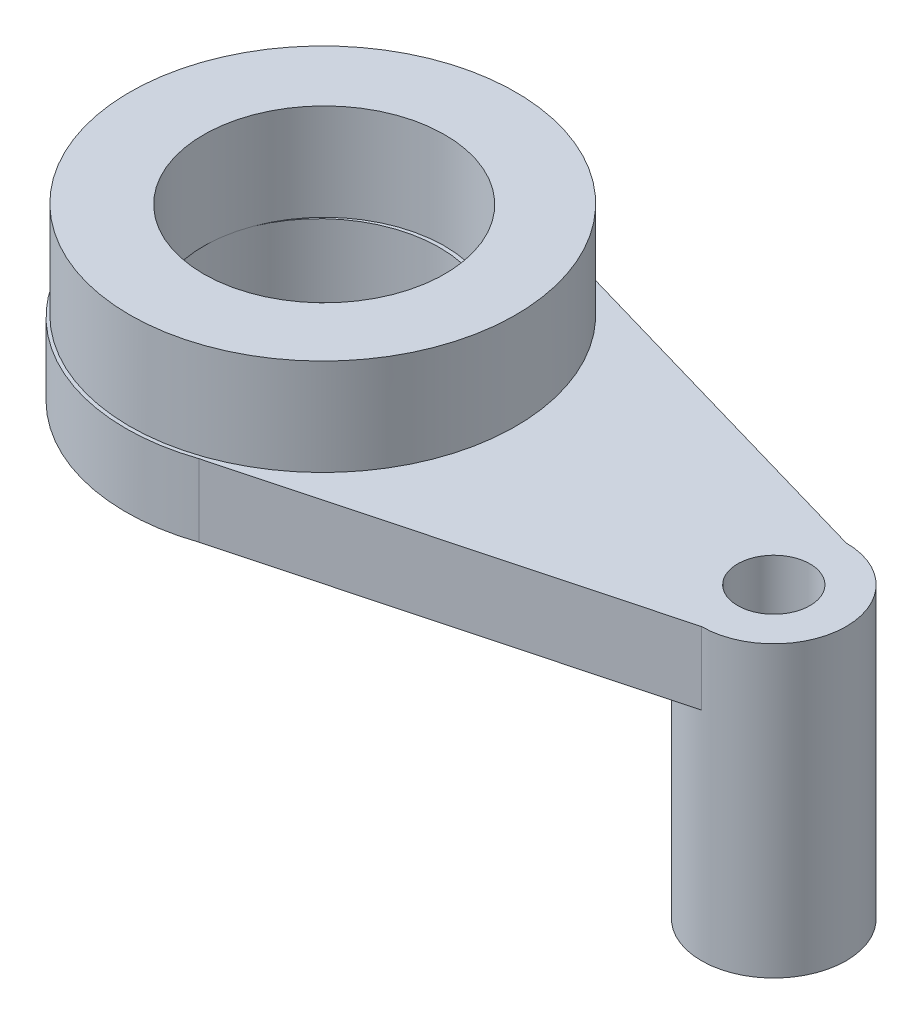
ISO-10303-21;
HEADER;
FILE_DESCRIPTION(('STEP AP214'),'2;1');
FILE_NAME('part.step','',(''),(''),'','','');
FILE_SCHEMA(('AUTOMOTIVE_DESIGN { 1 0 10303 214 1 1 1 1 }'));
ENDSEC;
DATA;
#1=APPLICATION_CONTEXT('core data for automotive mechanical design processes');
#2=APPLICATION_PROTOCOL_DEFINITION('international standard','automotive_design',2000,#1);
#3=PRODUCT_CONTEXT('',#1,'mechanical');
#4=PRODUCT('Part','Part','',(#3));
#5=PRODUCT_RELATED_PRODUCT_CATEGORY('part','',(#4));
#6=PRODUCT_DEFINITION_FORMATION('','',#4);
#7=PRODUCT_DEFINITION_CONTEXT('part definition',#1,'design');
#8=PRODUCT_DEFINITION('design','',#6,#7);
#9=PRODUCT_DEFINITION_SHAPE('','',#8);
#10=(LENGTH_UNIT() NAMED_UNIT(*) SI_UNIT(.MILLI.,.METRE.));
#11=(NAMED_UNIT(*) PLANE_ANGLE_UNIT() SI_UNIT($,.RADIAN.));
#12=(NAMED_UNIT(*) SI_UNIT($,.STERADIAN.) SOLID_ANGLE_UNIT());
#13=UNCERTAINTY_MEASURE_WITH_UNIT(LENGTH_MEASURE(1.E-05),#10,'distance_accuracy_value','');
#14=(GEOMETRIC_REPRESENTATION_CONTEXT(3) GLOBAL_UNCERTAINTY_ASSIGNED_CONTEXT((#13)) GLOBAL_UNIT_ASSIGNED_CONTEXT((#10,
#11,#12)) REPRESENTATION_CONTEXT('',''));
#15=CARTESIAN_POINT('',(0.,0.,0.));
#16=DIRECTION('',(0.,0.,1.));
#17=DIRECTION('',(1.,0.,0.));
#18=AXIS2_PLACEMENT_3D('',#15,#16,#17);
#19=CARTESIAN_POINT('',(0.,6000.,0.));
#20=DIRECTION('',(0.,1.,0.));
#21=DIRECTION('',(0.,0.,1.));
#22=AXIS2_PLACEMENT_3D('',#19,#20,#21);
#23=PLANE('',#22);
#24=CARTESIAN_POINT('',(-121.899995114227,6000.,313.884146472296));
#25=DIRECTION('',(0.,1.,0.));
#26=DIRECTION('',(0.,0.,1.));
#27=AXIS2_PLACEMENT_3D('',#24,#25,#26);
#28=CIRCLE('',#27,9999.99999999983);
#29=CARTESIAN_POINT('',(9259.44042100298,6000.,3776.60735182998));
#30=VERTEX_POINT('',#29);
#31=CARTESIAN_POINT('',(-9381.34041612079,6000.,-3462.72320534844));
#32=VERTEX_POINT('',#31);
#33=EDGE_CURVE('E208',#30,#32,#28,.T.);
#34=ORIENTED_EDGE('',*,*,#33,.F.);
#35=CARTESIAN_POINT('',(0.,6000.,0.));
#36=DIRECTION('',(0.,1.,0.));
#37=DIRECTION('',(0.,0.,1.));
#38=AXIS2_PLACEMENT_3D('',#35,#36,#37);
#39=CIRCLE('',#38,10000.);
#40=EDGE_CURVE('E237',#30,#32,#39,.T.);
#41=ORIENTED_EDGE('',*,*,#40,.T.);
#42=EDGE_LOOP('',(#34,#41));
#43=FACE_BOUND('',#42,.T.);
#44=ADVANCED_FACE('F120',(#43),#23,.T.);
#45=CARTESIAN_POINT('',(4353.8062178404,6000.,-15046.8150073174));
#46=DIRECTION('',(-0.277949056655731,0.,0.960595816097587));
#47=DIRECTION('',(0.960595816097587,0.,0.277949056655731));
#48=AXIS2_PLACEMENT_3D('',#45,#46,#47);
#49=PLANE('',#48);
#50=DIRECTION('',(-0.960595816097587,0.,-0.277949056655731));
#51=VECTOR('',#50,1.);
#52=CARTESIAN_POINT('',(4353.8062178404,0.,-15046.8150073174));
#53=LINE('',#52,#51);
#54=CARTESIAN_POINT('',(37945.6012297066,0.,-5327.00613614031));
#55=VERTEX_POINT('',#54);
#56=CARTESIAN_POINT('',(4453.52869830859,0.,-15017.9602393608));
#57=VERTEX_POINT('',#56);
#58=EDGE_CURVE('E177',#55,#57,#53,.T.);
#59=ORIENTED_EDGE('',*,*,#58,.T.);
#60=DIRECTION('',(0.,-1.,0.));
#61=VECTOR('',#60,1.);
#62=CARTESIAN_POINT('',(4453.52869830859,6000.,-15017.9602393608));
#63=LINE('',#62,#61);
#64=CARTESIAN_POINT('',(4453.52869830859,6000.,-15017.9602393608));
#65=VERTEX_POINT('',#64);
#66=EDGE_CURVE('E204',#65,#57,#63,.T.);
#67=ORIENTED_EDGE('',*,*,#66,.F.);
#68=DIRECTION('',(-0.960595816097587,0.,-0.277949056655731));
#69=VECTOR('',#68,1.);
#70=CARTESIAN_POINT('',(4353.8062178404,6000.,-15046.8150073174));
#71=LINE('',#70,#69);
#72=CARTESIAN_POINT('',(7213.76224733758,6000.,-14219.2847733164));
#73=VERTEX_POINT('',#72);
#74=EDGE_CURVE('E193',#73,#65,#71,.T.);
#75=ORIENTED_EDGE('',*,*,#74,.F.);
#76=CARTESIAN_POINT('',(37945.6012297066,6000.,-5327.00613614031));
#77=VERTEX_POINT('',#76);
#78=EDGE_CURVE('E197',#77,#73,#71,.T.);
#79=ORIENTED_EDGE('',*,*,#78,.F.);
#80=DIRECTION('',(0.,-1.,0.));
#81=VECTOR('',#80,1.);
#82=CARTESIAN_POINT('',(37945.6012297066,6000.,-5327.00613614031));
#83=LINE('',#82,#81);
#84=EDGE_CURVE('E206',#77,#55,#83,.T.);
#85=ORIENTED_EDGE('',*,*,#84,.T.);
#86=EDGE_LOOP('',(#59,#67,#75,#79,#85));
#87=FACE_BOUND('',#86,.T.);
#88=ADVANCED_FACE('F227',(#87),#49,.F.);
#89=CARTESIAN_POINT('',(4186.3616842739,6000.,15683.7031038346));
#90=DIRECTION('',(0.257895047947268,0.,0.966172937027464));
#91=DIRECTION('',(0.966172937027464,0.,-0.257895047947268));
#92=AXIS2_PLACEMENT_3D('',#89,#90,#91);
#93=PLANE('',#92);
#94=DIRECTION('',(-0.966172937027464,0.,0.257895047947268));
#95=VECTOR('',#94,1.);
#96=CARTESIAN_POINT('',(4186.3616842739,0.,15683.7031038346));
#97=LINE('',#96,#95);
#98=CARTESIAN_POINT('',(37944.1541175191,0.,6672.9275330017));
#99=VERTEX_POINT('',#98);
#100=CARTESIAN_POINT('',(5073.29210511279,0.,15446.9598101217));
#101=VERTEX_POINT('',#100);
#102=EDGE_CURVE('E171',#99,#101,#97,.T.);
#103=ORIENTED_EDGE('',*,*,#102,.F.);
#104=DIRECTION('',(0.,-1.,0.));
#105=VECTOR('',#104,1.);
#106=CARTESIAN_POINT('',(37944.1541175191,6000.,6672.927533003));
#107=LINE('',#106,#105);
#108=CARTESIAN_POINT('',(37944.1541175191,6000.,6672.927533003));
#109=VERTEX_POINT('',#108);
#110=EDGE_CURVE('E182',#109,#99,#107,.T.);
#111=ORIENTED_EDGE('',*,*,#110,.F.);
#112=DIRECTION('',(-0.966172937027464,0.,0.257895047947268));
#113=VECTOR('',#112,1.);
#114=CARTESIAN_POINT('',(4186.3616842739,6000.,15683.7031038346));
#115=LINE('',#114,#113);
#116=CARTESIAN_POINT('',(5073.29210511279,6000.,15446.9598101217));
#117=VERTEX_POINT('',#116);
#118=EDGE_CURVE('E190',#109,#117,#115,.T.);
#119=ORIENTED_EDGE('',*,*,#118,.T.);
#120=DIRECTION('',(0.,-1.,0.));
#121=VECTOR('',#120,1.);
#122=CARTESIAN_POINT('',(5073.29210511279,6000.,15446.9598101217));
#123=LINE('',#122,#121);
#124=EDGE_CURVE('E187',#117,#101,#123,.T.);
#125=ORIENTED_EDGE('',*,*,#124,.T.);
#126=EDGE_LOOP('',(#103,#111,#119,#125));
#127=FACE_BOUND('',#126,.T.);
#128=ADVANCED_FACE('F191',(#127),#93,.T.);
#129=CARTESIAN_POINT('',(0.,0.,0.));
#130=DIRECTION('',(0.,1.,0.));
#131=DIRECTION('',(0.,0.,1.));
#132=AXIS2_PLACEMENT_3D('',#129,#130,#131);
#133=PLANE('',#132);
#134=ORIENTED_EDGE('',*,*,#58,.F.);
#135=CARTESIAN_POINT('',(37945.6012297066,0.,672.960785686102));
#136=DIRECTION('',(0.,1.,0.));
#137=DIRECTION('',(0.,0.,1.));
#138=AXIS2_PLACEMENT_3D('',#135,#136,#137);
#139=CIRCLE('',#138,5999.9669218277);
#140=EDGE_CURVE('E12',#55,#99,#139,.T.);
#141=ORIENTED_EDGE('',*,*,#140,.T.);
#142=ORIENTED_EDGE('',*,*,#102,.T.);
#143=CARTESIAN_POINT('',(-121.899995114227,0.,313.884146472296));
#144=DIRECTION('',(0.,1.,0.));
#145=DIRECTION('',(0.,0.,1.));
#146=AXIS2_PLACEMENT_3D('',#143,#144,#145);
#147=CIRCLE('',#146,15999.9999999998);
#148=EDGE_CURVE('E211',#57,#101,#147,.T.);
#149=ORIENTED_EDGE('',*,*,#148,.F.);
#150=EDGE_LOOP('',(#134,#141,#142,#149));
#151=FACE_BOUND('',#150,.T.);
#152=CARTESIAN_POINT('',(-121.899995114227,0.,313.884146472296));
#153=DIRECTION('',(0.,1.,0.));
#154=DIRECTION('',(0.,0.,1.));
#155=AXIS2_PLACEMENT_3D('',#152,#153,#154);
#156=CIRCLE('',#155,9999.99999999983);
#157=CARTESIAN_POINT('',(-121.899995114227,0.,10313.8841464721));
#158=VERTEX_POINT('',#157);
#159=EDGE_CURVE('E213',#158,#158,#156,.T.);
#160=ORIENTED_EDGE('',*,*,#159,.T.);
#161=EDGE_LOOP('',(#160));
#162=FACE_BOUND('',#161,.T.);
#163=ADVANCED_FACE('F173',(#151,#162),#133,.F.);
#164=ORIENTED_EDGE('',*,*,#118,.F.);
#165=CARTESIAN_POINT('',(37945.6012297066,6000.,672.960785686102));
#166=DIRECTION('',(0.,1.,0.));
#167=DIRECTION('',(0.,0.,1.));
#168=AXIS2_PLACEMENT_3D('',#165,#166,#167);
#169=CIRCLE('',#168,5999.966921829);
#170=EDGE_CURVE('E184',#109,#77,#169,.T.);
#171=ORIENTED_EDGE('',*,*,#170,.T.);
#172=ORIENTED_EDGE('',*,*,#78,.T.);
#173=CARTESIAN_POINT('',(-121.899995114227,6000.,0.));
#174=DIRECTION('',(0.,1.,0.));
#175=DIRECTION('',(0.,0.,1.));
#176=AXIS2_PLACEMENT_3D('',#173,#174,#175);
#177=CIRCLE('',#176,16000.);
#178=CARTESIAN_POINT('',(-16121.1302636504,6000.,156.94207324475));
#179=VERTEX_POINT('',#178);
#180=EDGE_CURVE('E130',#179,#73,#177,.T.);
#181=ORIENTED_EDGE('',*,*,#180,.F.);
#182=CARTESIAN_POINT('',(-121.899995114227,6000.,313.884146472296));
#183=DIRECTION('',(0.,1.,0.));
#184=DIRECTION('',(0.,0.,1.));
#185=AXIS2_PLACEMENT_3D('',#182,#183,#184);
#186=CIRCLE('',#185,15999.9999999998);
#187=EDGE_CURVE('E217',#179,#117,#186,.T.);
#188=ORIENTED_EDGE('',*,*,#187,.T.);
#189=EDGE_LOOP('',(#164,#171,#172,#181,#188));
#190=FACE_BOUND('',#189,.T.);
#191=CARTESIAN_POINT('',(37945.6012297066,6000.,672.960785686102));
#192=DIRECTION('',(0.,1.,0.));
#193=DIRECTION('',(0.,0.,1.));
#194=AXIS2_PLACEMENT_3D('',#191,#192,#193);
#195=CIRCLE('',#194,3000.00000000259);
#196=CARTESIAN_POINT('',(37945.6012297066,6000.,3672.96078568869));
#197=VERTEX_POINT('',#196);
#198=EDGE_CURVE('E219',#197,#197,#195,.T.);
#199=ORIENTED_EDGE('',*,*,#198,.F.);
#200=EDGE_LOOP('',(#199));
#201=FACE_BOUND('',#200,.T.);
#202=ADVANCED_FACE('F221',(#190,#201),#23,.T.);
#203=CARTESIAN_POINT('',(37945.6012297066,6000.,672.960785686102));
#204=DIRECTION('',(0.,-1.,0.));
#205=DIRECTION('',(0.,0.,-1.));
#206=AXIS2_PLACEMENT_3D('',#203,#204,#205);
#207=CYLINDRICAL_SURFACE('',#206,3000.00000000259);
#208=ORIENTED_EDGE('',*,*,#198,.T.);
#209=EDGE_LOOP('',(#208));
#210=FACE_BOUND('',#209,.T.);
#211=CARTESIAN_POINT('',(37945.6012297066,-18000.,672.960785686102));
#212=DIRECTION('',(0.,1.,0.));
#213=DIRECTION('',(0.,0.,1.));
#214=AXIS2_PLACEMENT_3D('',#211,#212,#213);
#215=CIRCLE('',#214,3000.00000000258);
#216=CARTESIAN_POINT('',(37945.6012297066,-18000.,3672.96078568869));
#217=VERTEX_POINT('',#216);
#218=EDGE_CURVE('E245',#217,#217,#215,.T.);
#219=ORIENTED_EDGE('',*,*,#218,.F.);
#220=EDGE_LOOP('',(#219));
#221=FACE_BOUND('',#220,.T.);
#222=ADVANCED_FACE('F253',(#210,#221),#207,.F.);
#223=CARTESIAN_POINT('',(37945.6012297066,6000.,672.960785686102));
#224=DIRECTION('',(0.,-1.,0.));
#225=DIRECTION('',(0.,0.,-1.));
#226=AXIS2_PLACEMENT_3D('',#223,#224,#225);
#227=CYLINDRICAL_SURFACE('',#226,5999.966921829);
#228=ORIENTED_EDGE('',*,*,#110,.T.);
#229=ORIENTED_EDGE('',*,*,#140,.F.);
#230=ORIENTED_EDGE('',*,*,#84,.F.);
#231=ORIENTED_EDGE('',*,*,#170,.F.);
#232=EDGE_LOOP('',(#228,#229,#230,#231));
#233=FACE_BOUND('',#232,.T.);
#234=CARTESIAN_POINT('',(37945.6012297066,-18000.,672.960785686102));
#235=DIRECTION('',(0.,1.,0.));
#236=DIRECTION('',(0.,0.,1.));
#237=AXIS2_PLACEMENT_3D('',#234,#235,#236);
#238=CIRCLE('',#237,5999.9669218277);
#239=CARTESIAN_POINT('',(37945.6012297066,-18000.,6672.9277075138));
#240=VERTEX_POINT('',#239);
#241=EDGE_CURVE('E243',#240,#240,#238,.T.);
#242=ORIENTED_EDGE('',*,*,#241,.T.);
#243=EDGE_LOOP('',(#242));
#244=FACE_BOUND('',#243,.T.);
#245=ADVANCED_FACE('F121',(#233,#244),#227,.T.);
#246=CARTESIAN_POINT('',(-121.899995114227,6000.,313.884146472296));
#247=DIRECTION('',(0.,-1.,0.));
#248=DIRECTION('',(0.,0.,-1.));
#249=AXIS2_PLACEMENT_3D('',#246,#247,#248);
#250=CYLINDRICAL_SURFACE('',#249,9999.99999999983);
#251=ORIENTED_EDGE('',*,*,#33,.T.);
#252=EDGE_CURVE('E215',#32,#30,#28,.T.);
#253=ORIENTED_EDGE('',*,*,#252,.T.);
#254=EDGE_LOOP('',(#251,#253));
#255=FACE_BOUND('',#254,.T.);
#256=ORIENTED_EDGE('',*,*,#159,.F.);
#257=EDGE_LOOP('',(#256));
#258=FACE_BOUND('',#257,.T.);
#259=ADVANCED_FACE('F259',(#255,#258),#250,.F.);
#260=CARTESIAN_POINT('',(-121.899995114227,6000.,313.884146472296));
#261=DIRECTION('',(0.,-1.,0.));
#262=DIRECTION('',(0.,0.,-1.));
#263=AXIS2_PLACEMENT_3D('',#260,#261,#262);
#264=CYLINDRICAL_SURFACE('',#263,15999.9999999998);
#265=EDGE_CURVE('E200',#65,#179,#186,.T.);
#266=ORIENTED_EDGE('',*,*,#265,.F.);
#267=ORIENTED_EDGE('',*,*,#66,.T.);
#268=ORIENTED_EDGE('',*,*,#148,.T.);
#269=ORIENTED_EDGE('',*,*,#124,.F.);
#270=ORIENTED_EDGE('',*,*,#187,.F.);
#271=EDGE_LOOP('',(#266,#267,#268,#269,#270));
#272=FACE_BOUND('',#271,.T.);
#273=ADVANCED_FACE('F255',(#272),#264,.T.);
#274=CARTESIAN_POINT('',(-121.899995114227,6000.,0.));
#275=DIRECTION('',(0.,1.,0.));
#276=DIRECTION('',(0.,0.,1.));
#277=AXIS2_PLACEMENT_3D('',#274,#275,#276);
#278=PLANE('',#277);
#279=EDGE_CURVE('E226',#73,#179,#177,.T.);
#280=ORIENTED_EDGE('',*,*,#279,.F.);
#281=ORIENTED_EDGE('',*,*,#74,.T.);
#282=ORIENTED_EDGE('',*,*,#265,.T.);
#283=EDGE_LOOP('',(#280,#281,#282));
#284=FACE_BOUND('',#283,.T.);
#285=ADVANCED_FACE('F263',(#284),#278,.F.);
#286=CARTESIAN_POINT('',(-121.899995114227,14000.,0.));
#287=DIRECTION('',(0.,1.,0.));
#288=DIRECTION('',(0.,0.,1.));
#289=AXIS2_PLACEMENT_3D('',#286,#287,#288);
#290=PLANE('',#289);
#291=CARTESIAN_POINT('',(-121.899995114227,14000.,0.));
#292=DIRECTION('',(0.,1.,0.));
#293=DIRECTION('',(0.,0.,1.));
#294=AXIS2_PLACEMENT_3D('',#291,#292,#293);
#295=CIRCLE('',#294,16000.);
#296=CARTESIAN_POINT('',(-121.899995114227,14000.,16000.));
#297=VERTEX_POINT('',#296);
#298=EDGE_CURVE('E225',#297,#297,#295,.T.);
#299=ORIENTED_EDGE('',*,*,#298,.T.);
#300=EDGE_LOOP('',(#299));
#301=FACE_BOUND('',#300,.T.);
#302=CARTESIAN_POINT('',(0.,14000.,0.));
#303=DIRECTION('',(0.,1.,0.));
#304=DIRECTION('',(0.,0.,1.));
#305=AXIS2_PLACEMENT_3D('',#302,#303,#304);
#306=CIRCLE('',#305,10000.);
#307=CARTESIAN_POINT('',(0.,14000.,10000.));
#308=VERTEX_POINT('',#307);
#309=EDGE_CURVE('E234',#308,#308,#306,.T.);
#310=ORIENTED_EDGE('',*,*,#309,.F.);
#311=EDGE_LOOP('',(#310));
#312=FACE_BOUND('',#311,.T.);
#313=ADVANCED_FACE('F286',(#301,#312),#290,.T.);
#314=ORIENTED_EDGE('',*,*,#252,.F.);
#315=EDGE_CURVE('E132',#32,#30,#39,.T.);
#316=ORIENTED_EDGE('',*,*,#315,.T.);
#317=EDGE_LOOP('',(#314,#316));
#318=FACE_BOUND('',#317,.T.);
#319=ADVANCED_FACE('F289',(#318),#278,.F.);
#320=CARTESIAN_POINT('',(-121.899995114227,14000.,0.));
#321=DIRECTION('',(0.,-1.,0.));
#322=DIRECTION('',(0.,0.,-1.));
#323=AXIS2_PLACEMENT_3D('',#320,#321,#322);
#324=CYLINDRICAL_SURFACE('',#323,16000.);
#325=ORIENTED_EDGE('',*,*,#298,.F.);
#326=EDGE_LOOP('',(#325));
#327=FACE_BOUND('',#326,.T.);
#328=ORIENTED_EDGE('',*,*,#279,.T.);
#329=ORIENTED_EDGE('',*,*,#180,.T.);
#330=EDGE_LOOP('',(#328,#329));
#331=FACE_BOUND('',#330,.T.);
#332=ADVANCED_FACE('F274',(#327,#331),#324,.T.);
#333=CARTESIAN_POINT('',(0.,14000.,0.));
#334=DIRECTION('',(0.,-1.,0.));
#335=DIRECTION('',(0.,0.,-1.));
#336=AXIS2_PLACEMENT_3D('',#333,#334,#335);
#337=CYLINDRICAL_SURFACE('',#336,10000.);
#338=ORIENTED_EDGE('',*,*,#309,.T.);
#339=EDGE_LOOP('',(#338));
#340=FACE_BOUND('',#339,.T.);
#341=ORIENTED_EDGE('',*,*,#40,.F.);
#342=ORIENTED_EDGE('',*,*,#315,.F.);
#343=EDGE_LOOP('',(#341,#342));
#344=FACE_BOUND('',#343,.T.);
#345=ADVANCED_FACE('F296',(#340,#344),#337,.F.);
#346=CARTESIAN_POINT('',(37945.6012297066,-18000.,672.960785686102));
#347=DIRECTION('',(0.,1.,0.));
#348=DIRECTION('',(0.,0.,1.));
#349=AXIS2_PLACEMENT_3D('',#346,#347,#348);
#350=PLANE('',#349);
#351=ORIENTED_EDGE('',*,*,#218,.T.);
#352=EDGE_LOOP('',(#351));
#353=FACE_BOUND('',#352,.T.);
#354=ORIENTED_EDGE('',*,*,#241,.F.);
#355=EDGE_LOOP('',(#354));
#356=FACE_BOUND('',#355,.T.);
#357=ADVANCED_FACE('F249',(#353,#356),#350,.F.);
#358=CLOSED_SHELL('',(#44,#88,#128,#163,#202,#222,#245,#259,#273,#285,#313,#319,#332,#345,#357));
#359=MANIFOLD_SOLID_BREP('B2',#358);
#360=ADVANCED_BREP_SHAPE_REPRESENTATION('',(#18,#359),#14);
#361=SHAPE_DEFINITION_REPRESENTATION(#9,#360);
ENDSEC;
END-ISO-10303-21;
